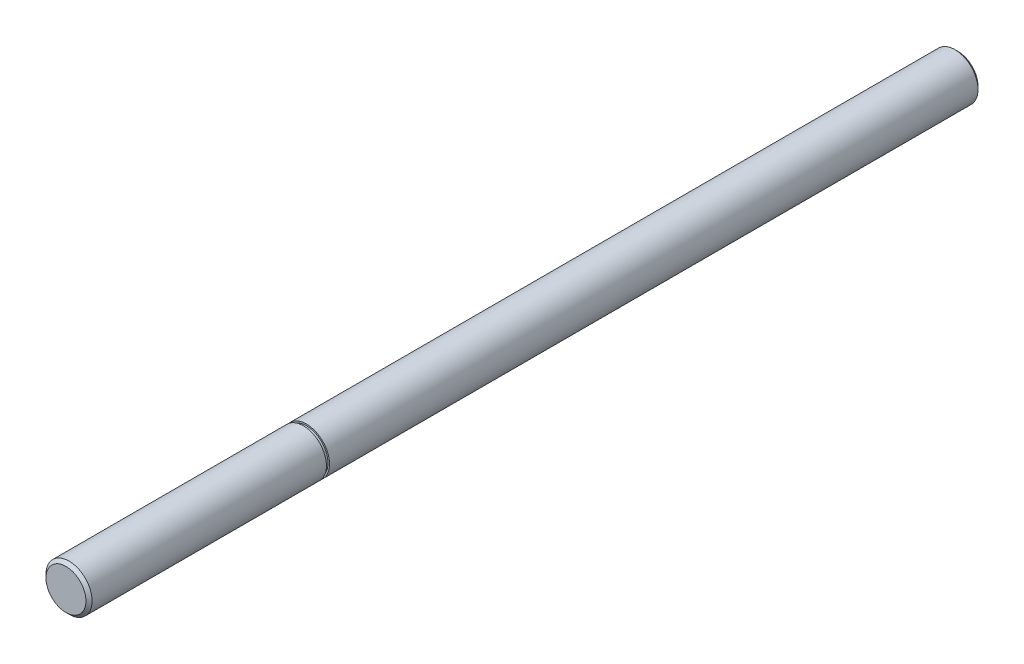
ISO-10303-21;
HEADER;
FILE_DESCRIPTION(('STEP AP214'),'2;1');
FILE_NAME('part.step','',(''),(''),'','','');
FILE_SCHEMA(('AUTOMOTIVE_DESIGN { 1 0 10303 214 1 1 1 1 }'));
ENDSEC;
DATA;
#1=APPLICATION_CONTEXT('core data for automotive mechanical design processes');
#2=APPLICATION_PROTOCOL_DEFINITION('international standard','automotive_design',2000,#1);
#3=PRODUCT_CONTEXT('',#1,'mechanical');
#4=PRODUCT('Part','Part','',(#3));
#5=PRODUCT_RELATED_PRODUCT_CATEGORY('part','',(#4));
#6=PRODUCT_DEFINITION_FORMATION('','',#4);
#7=PRODUCT_DEFINITION_CONTEXT('part definition',#1,'design');
#8=PRODUCT_DEFINITION('design','',#6,#7);
#9=PRODUCT_DEFINITION_SHAPE('','',#8);
#10=(LENGTH_UNIT() NAMED_UNIT(*) SI_UNIT(.MILLI.,.METRE.));
#11=(NAMED_UNIT(*) PLANE_ANGLE_UNIT() SI_UNIT($,.RADIAN.));
#12=(NAMED_UNIT(*) SI_UNIT($,.STERADIAN.) SOLID_ANGLE_UNIT());
#13=UNCERTAINTY_MEASURE_WITH_UNIT(LENGTH_MEASURE(1.E-05),#10,'distance_accuracy_value','');
#14=(GEOMETRIC_REPRESENTATION_CONTEXT(3) GLOBAL_UNCERTAINTY_ASSIGNED_CONTEXT((#13)) GLOBAL_UNIT_ASSIGNED_CONTEXT((#10,
#11,#12)) REPRESENTATION_CONTEXT('',''));
#15=CARTESIAN_POINT('',(0.,0.,0.));
#16=DIRECTION('',(0.,0.,1.));
#17=DIRECTION('',(1.,0.,0.));
#18=AXIS2_PLACEMENT_3D('',#15,#16,#17);
#19=CARTESIAN_POINT('',(0.,0.,290.));
#20=DIRECTION('',(0.,0.,-1.));
#21=DIRECTION('',(-1.,0.,0.));
#22=AXIS2_PLACEMENT_3D('',#19,#20,#21);
#23=CYLINDRICAL_SURFACE('',#22,7.5);
#24=CARTESIAN_POINT('',(0.,0.,1.00000000000006));
#25=DIRECTION('',(0.,0.,1.));
#26=DIRECTION('',(1.,0.,0.));
#27=AXIS2_PLACEMENT_3D('',#24,#25,#26);
#28=CIRCLE('',#27,7.5);
#29=CARTESIAN_POINT('',(7.5,0.,1.00000000000006));
#30=VERTEX_POINT('',#29);
#31=EDGE_CURVE('E50',#30,#30,#28,.T.);
#32=ORIENTED_EDGE('',*,*,#31,.T.);
#33=EDGE_LOOP('',(#32));
#34=FACE_BOUND('',#33,.T.);
#35=CARTESIAN_POINT('',(0.,0.,211.82));
#36=DIRECTION('',(0.,0.,1.));
#37=DIRECTION('',(1.,0.,0.));
#38=AXIS2_PLACEMENT_3D('',#35,#36,#37);
#39=CIRCLE('',#38,7.5);
#40=CARTESIAN_POINT('',(7.5,0.,211.82));
#41=VERTEX_POINT('',#40);
#42=EDGE_CURVE('E59',#41,#41,#39,.T.);
#43=ORIENTED_EDGE('',*,*,#42,.F.);
#44=EDGE_LOOP('',(#43));
#45=FACE_BOUND('',#44,.T.);
#46=ADVANCED_FACE('F38',(#34,#45),#23,.T.);
#47=CARTESIAN_POINT('',(0.,0.,0.));
#48=DIRECTION('',(0.,0.,1.));
#49=DIRECTION('',(1.,0.,0.));
#50=AXIS2_PLACEMENT_3D('',#47,#48,#49);
#51=PLANE('',#50);
#52=CARTESIAN_POINT('',(0.,0.,0.));
#53=DIRECTION('',(0.,0.,1.));
#54=DIRECTION('',(1.,0.,0.));
#55=AXIS2_PLACEMENT_3D('',#52,#53,#54);
#56=CIRCLE('',#55,6.49999999999995);
#57=CARTESIAN_POINT('',(6.49999999999995,0.,0.));
#58=VERTEX_POINT('',#57);
#59=EDGE_CURVE('E46',#58,#58,#56,.F.);
#60=ORIENTED_EDGE('',*,*,#59,.T.);
#61=EDGE_LOOP('',(#60));
#62=FACE_BOUND('',#61,.T.);
#63=ADVANCED_FACE('F84',(#62),#51,.F.);
#64=CARTESIAN_POINT('',(0.,0.,1.00000000000006));
#65=DIRECTION('',(0.,0.,1.));
#66=DIRECTION('',(1.,0.,0.));
#67=AXIS2_PLACEMENT_3D('',#64,#65,#66);
#68=CONICAL_SURFACE('',#67,7.5,0.785398163397444);
#69=ORIENTED_EDGE('',*,*,#59,.F.);
#70=EDGE_LOOP('',(#69));
#71=FACE_BOUND('',#70,.T.);
#72=ORIENTED_EDGE('',*,*,#31,.F.);
#73=EDGE_LOOP('',(#72));
#74=FACE_BOUND('',#73,.T.);
#75=ADVANCED_FACE('F79',(#71,#74),#68,.T.);
#76=CARTESIAN_POINT('',(0.,0.,211.82));
#77=DIRECTION('',(0.,0.,1.));
#78=DIRECTION('',(1.,0.,0.));
#79=AXIS2_PLACEMENT_3D('',#76,#77,#78);
#80=PLANE('',#79);
#81=CARTESIAN_POINT('',(0.,0.,211.82));
#82=DIRECTION('',(0.,0.,1.));
#83=DIRECTION('',(1.,0.,0.));
#84=AXIS2_PLACEMENT_3D('',#81,#82,#83);
#85=CIRCLE('',#84,7.);
#86=CARTESIAN_POINT('',(7.,0.,211.82));
#87=VERTEX_POINT('',#86);
#88=EDGE_CURVE('E63',#87,#87,#85,.T.);
#89=ORIENTED_EDGE('',*,*,#88,.F.);
#90=EDGE_LOOP('',(#89));
#91=FACE_BOUND('',#90,.T.);
#92=ORIENTED_EDGE('',*,*,#42,.T.);
#93=EDGE_LOOP('',(#92));
#94=FACE_BOUND('',#93,.T.);
#95=ADVANCED_FACE('F75',(#91,#94),#80,.T.);
#96=CARTESIAN_POINT('',(0.,0.,212.82));
#97=DIRECTION('',(0.,0.,1.));
#98=DIRECTION('',(1.,0.,0.));
#99=AXIS2_PLACEMENT_3D('',#96,#97,#98);
#100=PLANE('',#99);
#101=CARTESIAN_POINT('',(0.,0.,212.82));
#102=DIRECTION('',(0.,0.,1.));
#103=DIRECTION('',(1.,0.,0.));
#104=AXIS2_PLACEMENT_3D('',#101,#102,#103);
#105=CIRCLE('',#104,7.);
#106=CARTESIAN_POINT('',(7.,0.,212.82));
#107=VERTEX_POINT('',#106);
#108=EDGE_CURVE('E66',#107,#107,#105,.T.);
#109=ORIENTED_EDGE('',*,*,#108,.T.);
#110=EDGE_LOOP('',(#109));
#111=FACE_BOUND('',#110,.T.);
#112=CARTESIAN_POINT('',(0.,0.,212.82));
#113=DIRECTION('',(0.,0.,1.));
#114=DIRECTION('',(1.,0.,0.));
#115=AXIS2_PLACEMENT_3D('',#112,#113,#114);
#116=CIRCLE('',#115,7.5);
#117=CARTESIAN_POINT('',(7.5,0.,212.82));
#118=VERTEX_POINT('',#117);
#119=EDGE_CURVE('E60',#118,#118,#116,.T.);
#120=ORIENTED_EDGE('',*,*,#119,.F.);
#121=EDGE_LOOP('',(#120));
#122=FACE_BOUND('',#121,.T.);
#123=ADVANCED_FACE('F78',(#111,#122),#100,.F.);
#124=CARTESIAN_POINT('',(0.,0.,211.82));
#125=DIRECTION('',(0.,0.,1.));
#126=DIRECTION('',(1.,0.,0.));
#127=AXIS2_PLACEMENT_3D('',#124,#125,#126);
#128=CYLINDRICAL_SURFACE('',#127,7.);
#129=ORIENTED_EDGE('',*,*,#88,.T.);
#130=EDGE_LOOP('',(#129));
#131=FACE_BOUND('',#130,.T.);
#132=ORIENTED_EDGE('',*,*,#108,.F.);
#133=EDGE_LOOP('',(#132));
#134=FACE_BOUND('',#133,.T.);
#135=ADVANCED_FACE('F72',(#131,#134),#128,.T.);
#136=CARTESIAN_POINT('',(0.,0.,290.));
#137=DIRECTION('',(0.,0.,1.));
#138=DIRECTION('',(1.,0.,0.));
#139=AXIS2_PLACEMENT_3D('',#136,#137,#138);
#140=PLANE('',#139);
#141=CARTESIAN_POINT('',(0.,0.,290.));
#142=DIRECTION('',(0.,0.,1.));
#143=DIRECTION('',(1.,0.,0.));
#144=AXIS2_PLACEMENT_3D('',#141,#142,#143);
#145=CIRCLE('',#144,6.50000000000001);
#146=CARTESIAN_POINT('',(6.50000000000001,0.,290.));
#147=VERTEX_POINT('',#146);
#148=EDGE_CURVE('E10',#147,#147,#145,.T.);
#149=ORIENTED_EDGE('',*,*,#148,.T.);
#150=EDGE_LOOP('',(#149));
#151=FACE_BOUND('',#150,.T.);
#152=ADVANCED_FACE('F97',(#151),#140,.T.);
#153=CARTESIAN_POINT('',(0.,0.,290.));
#154=DIRECTION('',(0.,0.,-1.));
#155=DIRECTION('',(-1.,0.,0.));
#156=AXIS2_PLACEMENT_3D('',#153,#154,#155);
#157=CONICAL_SURFACE('',#156,6.50000000000001,0.785398163397473);
#158=CARTESIAN_POINT('',(0.,0.,289.));
#159=DIRECTION('',(0.,0.,1.));
#160=DIRECTION('',(1.,0.,0.));
#161=AXIS2_PLACEMENT_3D('',#158,#159,#160);
#162=CIRCLE('',#161,7.5);
#163=CARTESIAN_POINT('',(7.5,0.,289.));
#164=VERTEX_POINT('',#163);
#165=EDGE_CURVE('E54',#164,#164,#162,.F.);
#166=ORIENTED_EDGE('',*,*,#165,.F.);
#167=EDGE_LOOP('',(#166));
#168=FACE_BOUND('',#167,.T.);
#169=ORIENTED_EDGE('',*,*,#148,.F.);
#170=EDGE_LOOP('',(#169));
#171=FACE_BOUND('',#170,.T.);
#172=ADVANCED_FACE('F41',(#168,#171),#157,.T.);
#173=ORIENTED_EDGE('',*,*,#119,.T.);
#174=EDGE_LOOP('',(#173));
#175=FACE_BOUND('',#174,.T.);
#176=ORIENTED_EDGE('',*,*,#165,.T.);
#177=EDGE_LOOP('',(#176));
#178=FACE_BOUND('',#177,.T.);
#179=ADVANCED_FACE('F87',(#175,#178),#23,.T.);
#180=CLOSED_SHELL('',(#46,#63,#75,#95,#123,#135,#152,#172,#179));
#181=MANIFOLD_SOLID_BREP('B2',#180);
#182=ADVANCED_BREP_SHAPE_REPRESENTATION('',(#18,#181),#14);
#183=SHAPE_DEFINITION_REPRESENTATION(#9,#182);
ENDSEC;
END-ISO-10303-21;
